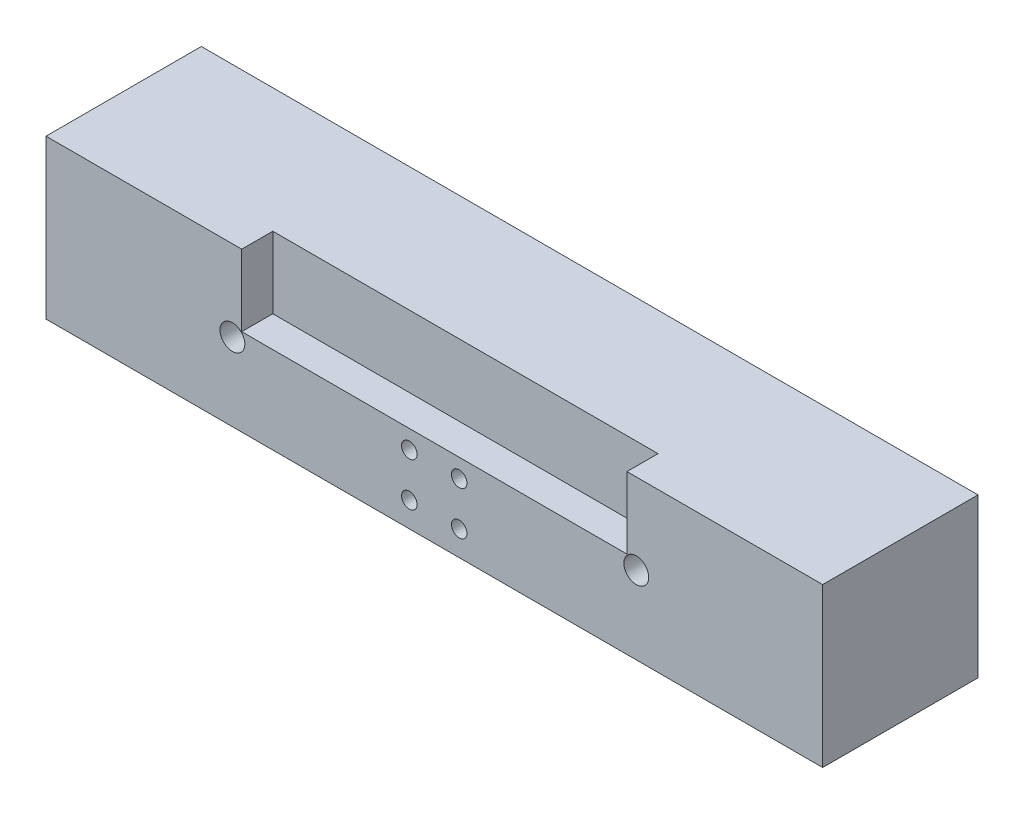
ISO-10303-21;
HEADER;
FILE_DESCRIPTION(('STEP AP214'),'2;1');
FILE_NAME('part.step','',(''),(''),'','','');
FILE_SCHEMA(('AUTOMOTIVE_DESIGN { 1 0 10303 214 1 1 1 1 }'));
ENDSEC;
DATA;
#1=APPLICATION_CONTEXT('core data for automotive mechanical design processes');
#2=APPLICATION_PROTOCOL_DEFINITION('international standard','automotive_design',2000,#1);
#3=PRODUCT_CONTEXT('',#1,'mechanical');
#4=PRODUCT('Part','Part','',(#3));
#5=PRODUCT_RELATED_PRODUCT_CATEGORY('part','',(#4));
#6=PRODUCT_DEFINITION_FORMATION('','',#4);
#7=PRODUCT_DEFINITION_CONTEXT('part definition',#1,'design');
#8=PRODUCT_DEFINITION('design','',#6,#7);
#9=PRODUCT_DEFINITION_SHAPE('','',#8);
#10=(LENGTH_UNIT() NAMED_UNIT(*) SI_UNIT(.MILLI.,.METRE.));
#11=(NAMED_UNIT(*) PLANE_ANGLE_UNIT() SI_UNIT($,.RADIAN.));
#12=(NAMED_UNIT(*) SI_UNIT($,.STERADIAN.) SOLID_ANGLE_UNIT());
#13=UNCERTAINTY_MEASURE_WITH_UNIT(LENGTH_MEASURE(1.E-05),#10,'distance_accuracy_value','');
#14=(GEOMETRIC_REPRESENTATION_CONTEXT(3) GLOBAL_UNCERTAINTY_ASSIGNED_CONTEXT((#13)) GLOBAL_UNIT_ASSIGNED_CONTEXT((#10,
#11,#12)) REPRESENTATION_CONTEXT('',''));
#15=CARTESIAN_POINT('',(0.,0.,0.));
#16=DIRECTION('',(0.,0.,1.));
#17=DIRECTION('',(1.,0.,0.));
#18=AXIS2_PLACEMENT_3D('',#15,#16,#17);
#19=CARTESIAN_POINT('',(-125.,51.,-25.));
#20=DIRECTION('',(1.,0.,0.));
#21=DIRECTION('',(0.,0.,-1.));
#22=AXIS2_PLACEMENT_3D('',#19,#20,#21);
#23=PLANE('',#22);
#24=DIRECTION('',(0.,0.,1.));
#25=VECTOR('',#24,1.);
#26=CARTESIAN_POINT('',(-125.,0.,-25.));
#27=LINE('',#26,#25);
#28=CARTESIAN_POINT('',(-125.,0.,-25.));
#29=VERTEX_POINT('',#28);
#30=CARTESIAN_POINT('',(-125.,0.,25.));
#31=VERTEX_POINT('',#30);
#32=EDGE_CURVE('E153',#29,#31,#27,.T.);
#33=ORIENTED_EDGE('',*,*,#32,.T.);
#34=DIRECTION('',(0.,-1.,0.));
#35=VECTOR('',#34,1.);
#36=CARTESIAN_POINT('',(-125.,51.,25.));
#37=LINE('',#36,#35);
#38=CARTESIAN_POINT('',(-125.,51.,25.));
#39=VERTEX_POINT('',#38);
#40=EDGE_CURVE('E11',#39,#31,#37,.T.);
#41=ORIENTED_EDGE('',*,*,#40,.F.);
#42=DIRECTION('',(0.,0.,1.));
#43=VECTOR('',#42,1.);
#44=CARTESIAN_POINT('',(-125.,51.,-25.));
#45=LINE('',#44,#43);
#46=CARTESIAN_POINT('',(-125.,51.,-25.));
#47=VERTEX_POINT('',#46);
#48=EDGE_CURVE('E162',#47,#39,#45,.T.);
#49=ORIENTED_EDGE('',*,*,#48,.F.);
#50=DIRECTION('',(0.,-1.,0.));
#51=VECTOR('',#50,1.);
#52=CARTESIAN_POINT('',(-125.,51.,-25.));
#53=LINE('',#52,#51);
#54=EDGE_CURVE('E169',#47,#29,#53,.T.);
#55=ORIENTED_EDGE('',*,*,#54,.T.);
#56=EDGE_LOOP('',(#33,#41,#49,#55));
#57=FACE_BOUND('',#56,.T.);
#58=ADVANCED_FACE('F17',(#57),#23,.F.);
#59=CARTESIAN_POINT('',(125.,51.,25.));
#60=DIRECTION('',(0.,0.,-1.));
#61=DIRECTION('',(-1.,0.,0.));
#62=AXIS2_PLACEMENT_3D('',#59,#60,#61);
#63=PLANE('',#62);
#64=CARTESIAN_POINT('',(-8.05025253169503,8.,25.));
#65=DIRECTION('',(0.,0.,1.));
#66=DIRECTION('',(1.,0.,0.));
#67=AXIS2_PLACEMENT_3D('',#64,#65,#66);
#68=CIRCLE('',#67,2.5);
#69=CARTESIAN_POINT('',(-5.55025253169503,8.,25.));
#70=VERTEX_POINT('',#69);
#71=EDGE_CURVE('E121',#70,#70,#68,.T.);
#72=ORIENTED_EDGE('',*,*,#71,.F.);
#73=EDGE_LOOP('',(#72));
#74=FACE_BOUND('',#73,.T.);
#75=CARTESIAN_POINT('',(-8.05025253169503,22.,25.));
#76=DIRECTION('',(0.,0.,1.));
#77=DIRECTION('',(1.,0.,0.));
#78=AXIS2_PLACEMENT_3D('',#75,#76,#77);
#79=CIRCLE('',#78,2.5);
#80=CARTESIAN_POINT('',(-5.55025253169503,22.,25.));
#81=VERTEX_POINT('',#80);
#82=EDGE_CURVE('E136',#81,#81,#79,.T.);
#83=ORIENTED_EDGE('',*,*,#82,.F.);
#84=EDGE_LOOP('',(#83));
#85=FACE_BOUND('',#84,.T.);
#86=CARTESIAN_POINT('',(8.,22.,25.));
#87=DIRECTION('',(0.,0.,1.));
#88=DIRECTION('',(1.,0.,0.));
#89=AXIS2_PLACEMENT_3D('',#86,#87,#88);
#90=CIRCLE('',#89,2.5);
#91=CARTESIAN_POINT('',(10.5,22.,25.));
#92=VERTEX_POINT('',#91);
#93=EDGE_CURVE('E130',#92,#92,#90,.T.);
#94=ORIENTED_EDGE('',*,*,#93,.F.);
#95=EDGE_LOOP('',(#94));
#96=FACE_BOUND('',#95,.T.);
#97=CARTESIAN_POINT('',(8.,8.,25.));
#98=DIRECTION('',(0.,0.,1.));
#99=DIRECTION('',(1.,0.,0.));
#100=AXIS2_PLACEMENT_3D('',#97,#98,#99);
#101=CIRCLE('',#100,2.5);
#102=CARTESIAN_POINT('',(10.5,8.,25.));
#103=VERTEX_POINT('',#102);
#104=EDGE_CURVE('E129',#103,#103,#101,.T.);
#105=ORIENTED_EDGE('',*,*,#104,.F.);
#106=EDGE_LOOP('',(#105));
#107=FACE_BOUND('',#106,.T.);
#108=CARTESIAN_POINT('',(-65.,25.,25.));
#109=DIRECTION('',(0.,0.,1.));
#110=DIRECTION('',(1.,0.,0.));
#111=AXIS2_PLACEMENT_3D('',#108,#109,#110);
#112=CIRCLE('',#111,4.);
#113=CARTESIAN_POINT('',(-61.,25.,25.));
#114=VERTEX_POINT('',#113);
#115=EDGE_CURVE('E154',#114,#114,#112,.T.);
#116=ORIENTED_EDGE('',*,*,#115,.F.);
#117=EDGE_LOOP('',(#116));
#118=FACE_BOUND('',#117,.T.);
#119=CARTESIAN_POINT('',(65.,25.,25.));
#120=DIRECTION('',(0.,0.,1.));
#121=DIRECTION('',(1.,0.,0.));
#122=AXIS2_PLACEMENT_3D('',#119,#120,#121);
#123=CIRCLE('',#122,4.);
#124=CARTESIAN_POINT('',(69.,25.,25.));
#125=VERTEX_POINT('',#124);
#126=EDGE_CURVE('E147',#125,#125,#123,.T.);
#127=ORIENTED_EDGE('',*,*,#126,.F.);
#128=EDGE_LOOP('',(#127));
#129=FACE_BOUND('',#128,.T.);
#130=DIRECTION('',(1.,0.,0.));
#131=VECTOR('',#130,1.);
#132=CARTESIAN_POINT('',(-62.,28.,25.));
#133=LINE('',#132,#131);
#134=CARTESIAN_POINT('',(-62.,28.,25.));
#135=VERTEX_POINT('',#134);
#136=CARTESIAN_POINT('',(62.,28.,25.));
#137=VERTEX_POINT('',#136);
#138=EDGE_CURVE('E112',#135,#137,#133,.T.);
#139=ORIENTED_EDGE('',*,*,#138,.F.);
#140=DIRECTION('',(0.,-1.,0.));
#141=VECTOR('',#140,1.);
#142=CARTESIAN_POINT('',(-62.,51.,25.));
#143=LINE('',#142,#141);
#144=CARTESIAN_POINT('',(-62.,51.,25.));
#145=VERTEX_POINT('',#144);
#146=EDGE_CURVE('E97',#145,#135,#143,.T.);
#147=ORIENTED_EDGE('',*,*,#146,.F.);
#148=DIRECTION('',(1.,0.,0.));
#149=VECTOR('',#148,1.);
#150=CARTESIAN_POINT('',(125.,51.,25.));
#151=LINE('',#150,#149);
#152=EDGE_CURVE('E68',#39,#145,#151,.T.);
#153=ORIENTED_EDGE('',*,*,#152,.F.);
#154=ORIENTED_EDGE('',*,*,#40,.T.);
#155=DIRECTION('',(1.,0.,0.));
#156=VECTOR('',#155,1.);
#157=CARTESIAN_POINT('',(125.,0.,25.));
#158=LINE('',#157,#156);
#159=CARTESIAN_POINT('',(125.,0.,25.));
#160=VERTEX_POINT('',#159);
#161=EDGE_CURVE('E172',#31,#160,#158,.T.);
#162=ORIENTED_EDGE('',*,*,#161,.T.);
#163=DIRECTION('',(0.,-1.,0.));
#164=VECTOR('',#163,1.);
#165=CARTESIAN_POINT('',(125.,51.,25.));
#166=LINE('',#165,#164);
#167=CARTESIAN_POINT('',(125.,51.,25.));
#168=VERTEX_POINT('',#167);
#169=EDGE_CURVE('E24',#168,#160,#166,.T.);
#170=ORIENTED_EDGE('',*,*,#169,.F.);
#171=CARTESIAN_POINT('',(62.,51.,25.));
#172=VERTEX_POINT('',#171);
#173=EDGE_CURVE('E164',#172,#168,#151,.T.);
#174=ORIENTED_EDGE('',*,*,#173,.F.);
#175=DIRECTION('',(0.,1.,0.));
#176=VECTOR('',#175,1.);
#177=CARTESIAN_POINT('',(62.,51.,25.));
#178=LINE('',#177,#176);
#179=EDGE_CURVE('E110',#137,#172,#178,.T.);
#180=ORIENTED_EDGE('',*,*,#179,.F.);
#181=EDGE_LOOP('',(#139,#147,#153,#154,#162,#170,#174,#180));
#182=FACE_BOUND('',#181,.T.);
#183=ADVANCED_FACE('F205',(#74,#85,#96,#107,#118,#129,#182),#63,.F.);
#184=CARTESIAN_POINT('',(125.,51.,-25.));
#185=DIRECTION('',(-1.,0.,0.));
#186=DIRECTION('',(0.,0.,1.));
#187=AXIS2_PLACEMENT_3D('',#184,#185,#186);
#188=PLANE('',#187);
#189=DIRECTION('',(0.,0.,-1.));
#190=VECTOR('',#189,1.);
#191=CARTESIAN_POINT('',(125.,0.,-25.));
#192=LINE('',#191,#190);
#193=CARTESIAN_POINT('',(125.,0.,-25.));
#194=VERTEX_POINT('',#193);
#195=EDGE_CURVE('E174',#160,#194,#192,.T.);
#196=ORIENTED_EDGE('',*,*,#195,.T.);
#197=DIRECTION('',(0.,-1.,0.));
#198=VECTOR('',#197,1.);
#199=CARTESIAN_POINT('',(125.,51.,-25.));
#200=LINE('',#199,#198);
#201=CARTESIAN_POINT('',(125.,51.,-25.));
#202=VERTEX_POINT('',#201);
#203=EDGE_CURVE('E178',#202,#194,#200,.T.);
#204=ORIENTED_EDGE('',*,*,#203,.F.);
#205=DIRECTION('',(0.,0.,-1.));
#206=VECTOR('',#205,1.);
#207=CARTESIAN_POINT('',(125.,51.,-25.));
#208=LINE('',#207,#206);
#209=EDGE_CURVE('E166',#168,#202,#208,.T.);
#210=ORIENTED_EDGE('',*,*,#209,.F.);
#211=ORIENTED_EDGE('',*,*,#169,.T.);
#212=EDGE_LOOP('',(#196,#204,#210,#211));
#213=FACE_BOUND('',#212,.T.);
#214=ADVANCED_FACE('F184',(#213),#188,.F.);
#215=CARTESIAN_POINT('',(125.,51.,-25.));
#216=DIRECTION('',(0.,0.,1.));
#217=DIRECTION('',(1.,0.,0.));
#218=AXIS2_PLACEMENT_3D('',#215,#216,#217);
#219=PLANE('',#218);
#220=CARTESIAN_POINT('',(-65.,25.,-25.));
#221=DIRECTION('',(0.,0.,1.));
#222=DIRECTION('',(1.,0.,0.));
#223=AXIS2_PLACEMENT_3D('',#220,#221,#222);
#224=CIRCLE('',#223,4.);
#225=CARTESIAN_POINT('',(-61.,25.,-25.));
#226=VERTEX_POINT('',#225);
#227=EDGE_CURVE('E150',#226,#226,#224,.T.);
#228=ORIENTED_EDGE('',*,*,#227,.T.);
#229=EDGE_LOOP('',(#228));
#230=FACE_BOUND('',#229,.T.);
#231=CARTESIAN_POINT('',(65.,25.,-25.));
#232=DIRECTION('',(0.,0.,1.));
#233=DIRECTION('',(1.,0.,0.));
#234=AXIS2_PLACEMENT_3D('',#231,#232,#233);
#235=CIRCLE('',#234,4.);
#236=CARTESIAN_POINT('',(69.,25.,-25.));
#237=VERTEX_POINT('',#236);
#238=EDGE_CURVE('E157',#237,#237,#235,.T.);
#239=ORIENTED_EDGE('',*,*,#238,.T.);
#240=EDGE_LOOP('',(#239));
#241=FACE_BOUND('',#240,.T.);
#242=DIRECTION('',(-1.,0.,0.));
#243=VECTOR('',#242,1.);
#244=CARTESIAN_POINT('',(125.,0.,-25.));
#245=LINE('',#244,#243);
#246=EDGE_CURVE('E61',#194,#29,#245,.T.);
#247=ORIENTED_EDGE('',*,*,#246,.T.);
#248=ORIENTED_EDGE('',*,*,#54,.F.);
#249=DIRECTION('',(-1.,0.,0.));
#250=VECTOR('',#249,1.);
#251=CARTESIAN_POINT('',(125.,51.,-25.));
#252=LINE('',#251,#250);
#253=EDGE_CURVE('E40',#202,#47,#252,.T.);
#254=ORIENTED_EDGE('',*,*,#253,.F.);
#255=ORIENTED_EDGE('',*,*,#203,.T.);
#256=EDGE_LOOP('',(#247,#248,#254,#255));
#257=FACE_BOUND('',#256,.T.);
#258=ADVANCED_FACE('F193',(#230,#241,#257),#219,.F.);
#259=CARTESIAN_POINT('',(0.,51.,0.));
#260=DIRECTION('',(0.,-1.,0.));
#261=DIRECTION('',(0.,0.,-1.));
#262=AXIS2_PLACEMENT_3D('',#259,#260,#261);
#263=PLANE('',#262);
#264=ORIENTED_EDGE('',*,*,#152,.T.);
#265=DIRECTION('',(0.,0.,1.));
#266=VECTOR('',#265,1.);
#267=CARTESIAN_POINT('',(-62.,51.,15.));
#268=LINE('',#267,#266);
#269=CARTESIAN_POINT('',(-62.,51.,15.));
#270=VERTEX_POINT('',#269);
#271=EDGE_CURVE('E119',#270,#145,#268,.T.);
#272=ORIENTED_EDGE('',*,*,#271,.F.);
#273=DIRECTION('',(-1.,0.,0.));
#274=VECTOR('',#273,1.);
#275=CARTESIAN_POINT('',(-62.,51.,15.));
#276=LINE('',#275,#274);
#277=CARTESIAN_POINT('',(62.,51.,15.));
#278=VERTEX_POINT('',#277);
#279=EDGE_CURVE('E102',#278,#270,#276,.T.);
#280=ORIENTED_EDGE('',*,*,#279,.F.);
#281=DIRECTION('',(0.,0.,1.));
#282=VECTOR('',#281,1.);
#283=CARTESIAN_POINT('',(62.,51.,15.));
#284=LINE('',#283,#282);
#285=EDGE_CURVE('E122',#278,#172,#284,.T.);
#286=ORIENTED_EDGE('',*,*,#285,.T.);
#287=ORIENTED_EDGE('',*,*,#173,.T.);
#288=ORIENTED_EDGE('',*,*,#209,.T.);
#289=ORIENTED_EDGE('',*,*,#253,.T.);
#290=ORIENTED_EDGE('',*,*,#48,.T.);
#291=EDGE_LOOP('',(#264,#272,#280,#286,#287,#288,#289,#290));
#292=FACE_BOUND('',#291,.T.);
#293=ADVANCED_FACE('F195',(#292),#263,.F.);
#294=CARTESIAN_POINT('',(0.,0.,0.));
#295=DIRECTION('',(0.,-1.,0.));
#296=DIRECTION('',(0.,0.,-1.));
#297=AXIS2_PLACEMENT_3D('',#294,#295,#296);
#298=PLANE('',#297);
#299=ORIENTED_EDGE('',*,*,#32,.F.);
#300=ORIENTED_EDGE('',*,*,#246,.F.);
#301=ORIENTED_EDGE('',*,*,#195,.F.);
#302=ORIENTED_EDGE('',*,*,#161,.F.);
#303=EDGE_LOOP('',(#299,#300,#301,#302));
#304=FACE_BOUND('',#303,.T.);
#305=ADVANCED_FACE('F189',(#304),#298,.T.);
#306=CARTESIAN_POINT('',(65.,25.,-25.));
#307=DIRECTION('',(0.,0.,1.));
#308=DIRECTION('',(1.,0.,0.));
#309=AXIS2_PLACEMENT_3D('',#306,#307,#308);
#310=CYLINDRICAL_SURFACE('',#309,4.);
#311=ORIENTED_EDGE('',*,*,#238,.F.);
#312=EDGE_LOOP('',(#311));
#313=FACE_BOUND('',#312,.T.);
#314=ORIENTED_EDGE('',*,*,#126,.T.);
#315=EDGE_LOOP('',(#314));
#316=FACE_BOUND('',#315,.T.);
#317=ADVANCED_FACE('F278',(#313,#316),#310,.F.);
#318=CARTESIAN_POINT('',(-65.,25.,-25.));
#319=DIRECTION('',(0.,0.,1.));
#320=DIRECTION('',(1.,0.,0.));
#321=AXIS2_PLACEMENT_3D('',#318,#319,#320);
#322=CYLINDRICAL_SURFACE('',#321,4.);
#323=ORIENTED_EDGE('',*,*,#227,.F.);
#324=EDGE_LOOP('',(#323));
#325=FACE_BOUND('',#324,.T.);
#326=ORIENTED_EDGE('',*,*,#115,.T.);
#327=EDGE_LOOP('',(#326));
#328=FACE_BOUND('',#327,.T.);
#329=ADVANCED_FACE('F274',(#325,#328),#322,.F.);
#330=CARTESIAN_POINT('',(8.,8.,15.));
#331=DIRECTION('',(0.,0.,1.));
#332=DIRECTION('',(1.,0.,0.));
#333=AXIS2_PLACEMENT_3D('',#330,#331,#332);
#334=CYLINDRICAL_SURFACE('',#333,2.5);
#335=CARTESIAN_POINT('',(8.,8.,15.));
#336=DIRECTION('',(0.,0.,1.));
#337=DIRECTION('',(1.,0.,0.));
#338=AXIS2_PLACEMENT_3D('',#335,#336,#337);
#339=CIRCLE('',#338,2.5);
#340=CARTESIAN_POINT('',(10.5,8.,15.));
#341=VERTEX_POINT('',#340);
#342=EDGE_CURVE('E144',#341,#341,#339,.T.);
#343=ORIENTED_EDGE('',*,*,#342,.F.);
#344=EDGE_LOOP('',(#343));
#345=FACE_BOUND('',#344,.T.);
#346=ORIENTED_EDGE('',*,*,#104,.T.);
#347=EDGE_LOOP('',(#346));
#348=FACE_BOUND('',#347,.T.);
#349=ADVANCED_FACE('F270',(#345,#348),#334,.F.);
#350=CARTESIAN_POINT('',(8.,8.,15.));
#351=DIRECTION('',(0.,0.,1.));
#352=DIRECTION('',(1.,0.,0.));
#353=AXIS2_PLACEMENT_3D('',#350,#351,#352);
#354=PLANE('',#353);
#355=ORIENTED_EDGE('',*,*,#342,.T.);
#356=EDGE_LOOP('',(#355));
#357=FACE_BOUND('',#356,.T.);
#358=ADVANCED_FACE('F252',(#357),#354,.T.);
#359=CARTESIAN_POINT('',(8.,22.,15.));
#360=DIRECTION('',(0.,0.,1.));
#361=DIRECTION('',(1.,0.,0.));
#362=AXIS2_PLACEMENT_3D('',#359,#360,#361);
#363=CYLINDRICAL_SURFACE('',#362,2.5);
#364=CARTESIAN_POINT('',(8.,22.,15.));
#365=DIRECTION('',(0.,0.,1.));
#366=DIRECTION('',(1.,0.,0.));
#367=AXIS2_PLACEMENT_3D('',#364,#365,#366);
#368=CIRCLE('',#367,2.5);
#369=CARTESIAN_POINT('',(10.5,22.,15.));
#370=VERTEX_POINT('',#369);
#371=EDGE_CURVE('E126',#370,#370,#368,.T.);
#372=ORIENTED_EDGE('',*,*,#371,.F.);
#373=EDGE_LOOP('',(#372));
#374=FACE_BOUND('',#373,.T.);
#375=ORIENTED_EDGE('',*,*,#93,.T.);
#376=EDGE_LOOP('',(#375));
#377=FACE_BOUND('',#376,.T.);
#378=ADVANCED_FACE('F248',(#374,#377),#363,.F.);
#379=CARTESIAN_POINT('',(8.,22.,15.));
#380=DIRECTION('',(0.,0.,1.));
#381=DIRECTION('',(1.,0.,0.));
#382=AXIS2_PLACEMENT_3D('',#379,#380,#381);
#383=PLANE('',#382);
#384=ORIENTED_EDGE('',*,*,#371,.T.);
#385=EDGE_LOOP('',(#384));
#386=FACE_BOUND('',#385,.T.);
#387=ADVANCED_FACE('F244',(#386),#383,.T.);
#388=CARTESIAN_POINT('',(-8.05025253169503,22.,15.));
#389=DIRECTION('',(0.,0.,1.));
#390=DIRECTION('',(1.,0.,0.));
#391=AXIS2_PLACEMENT_3D('',#388,#389,#390);
#392=CYLINDRICAL_SURFACE('',#391,2.5);
#393=CARTESIAN_POINT('',(-8.05025253169503,22.,15.));
#394=DIRECTION('',(0.,0.,1.));
#395=DIRECTION('',(1.,0.,0.));
#396=AXIS2_PLACEMENT_3D('',#393,#394,#395);
#397=CIRCLE('',#396,2.5);
#398=CARTESIAN_POINT('',(-5.55025253169503,22.,15.));
#399=VERTEX_POINT('',#398);
#400=EDGE_CURVE('E133',#399,#399,#397,.T.);
#401=ORIENTED_EDGE('',*,*,#400,.F.);
#402=EDGE_LOOP('',(#401));
#403=FACE_BOUND('',#402,.T.);
#404=ORIENTED_EDGE('',*,*,#82,.T.);
#405=EDGE_LOOP('',(#404));
#406=FACE_BOUND('',#405,.T.);
#407=ADVANCED_FACE('F247',(#403,#406),#392,.F.);
#408=CARTESIAN_POINT('',(-8.05025253169503,22.,15.));
#409=DIRECTION('',(0.,0.,1.));
#410=DIRECTION('',(1.,0.,0.));
#411=AXIS2_PLACEMENT_3D('',#408,#409,#410);
#412=PLANE('',#411);
#413=ORIENTED_EDGE('',*,*,#400,.T.);
#414=EDGE_LOOP('',(#413));
#415=FACE_BOUND('',#414,.T.);
#416=ADVANCED_FACE('F254',(#415),#412,.T.);
#417=CARTESIAN_POINT('',(-8.05025253169503,8.,15.));
#418=DIRECTION('',(0.,0.,1.));
#419=DIRECTION('',(1.,0.,0.));
#420=AXIS2_PLACEMENT_3D('',#417,#418,#419);
#421=CYLINDRICAL_SURFACE('',#420,2.5);
#422=CARTESIAN_POINT('',(-8.05025253169503,8.,15.));
#423=DIRECTION('',(0.,0.,1.));
#424=DIRECTION('',(1.,0.,0.));
#425=AXIS2_PLACEMENT_3D('',#422,#423,#424);
#426=CIRCLE('',#425,2.5);
#427=CARTESIAN_POINT('',(-5.55025253169503,8.,15.));
#428=VERTEX_POINT('',#427);
#429=EDGE_CURVE('E139',#428,#428,#426,.T.);
#430=ORIENTED_EDGE('',*,*,#429,.F.);
#431=EDGE_LOOP('',(#430));
#432=FACE_BOUND('',#431,.T.);
#433=ORIENTED_EDGE('',*,*,#71,.T.);
#434=EDGE_LOOP('',(#433));
#435=FACE_BOUND('',#434,.T.);
#436=ADVANCED_FACE('F257',(#432,#435),#421,.F.);
#437=CARTESIAN_POINT('',(-8.05025253169503,8.,15.));
#438=DIRECTION('',(0.,0.,1.));
#439=DIRECTION('',(1.,0.,0.));
#440=AXIS2_PLACEMENT_3D('',#437,#438,#439);
#441=PLANE('',#440);
#442=ORIENTED_EDGE('',*,*,#429,.T.);
#443=EDGE_LOOP('',(#442));
#444=FACE_BOUND('',#443,.T.);
#445=ADVANCED_FACE('F240',(#444),#441,.T.);
#446=CARTESIAN_POINT('',(-62.,51.,15.));
#447=DIRECTION('',(-1.,0.,0.));
#448=DIRECTION('',(0.,0.,1.));
#449=AXIS2_PLACEMENT_3D('',#446,#447,#448);
#450=PLANE('',#449);
#451=ORIENTED_EDGE('',*,*,#146,.T.);
#452=DIRECTION('',(0.,0.,1.));
#453=VECTOR('',#452,1.);
#454=CARTESIAN_POINT('',(-62.,28.,15.));
#455=LINE('',#454,#453);
#456=CARTESIAN_POINT('',(-62.,28.,15.));
#457=VERTEX_POINT('',#456);
#458=EDGE_CURVE('E92',#457,#135,#455,.T.);
#459=ORIENTED_EDGE('',*,*,#458,.F.);
#460=DIRECTION('',(0.,-1.,0.));
#461=VECTOR('',#460,1.);
#462=CARTESIAN_POINT('',(-62.,51.,15.));
#463=LINE('',#462,#461);
#464=EDGE_CURVE('E96',#270,#457,#463,.T.);
#465=ORIENTED_EDGE('',*,*,#464,.F.);
#466=ORIENTED_EDGE('',*,*,#271,.T.);
#467=EDGE_LOOP('',(#451,#459,#465,#466));
#468=FACE_BOUND('',#467,.T.);
#469=ADVANCED_FACE('F94',(#468),#450,.F.);
#470=CARTESIAN_POINT('',(62.,51.,15.));
#471=DIRECTION('',(1.,0.,0.));
#472=DIRECTION('',(0.,0.,-1.));
#473=AXIS2_PLACEMENT_3D('',#470,#471,#472);
#474=PLANE('',#473);
#475=ORIENTED_EDGE('',*,*,#179,.T.);
#476=ORIENTED_EDGE('',*,*,#285,.F.);
#477=DIRECTION('',(0.,1.,0.));
#478=VECTOR('',#477,1.);
#479=CARTESIAN_POINT('',(62.,51.,15.));
#480=LINE('',#479,#478);
#481=CARTESIAN_POINT('',(62.,28.,15.));
#482=VERTEX_POINT('',#481);
#483=EDGE_CURVE('E31',#482,#278,#480,.T.);
#484=ORIENTED_EDGE('',*,*,#483,.F.);
#485=DIRECTION('',(0.,0.,1.));
#486=VECTOR('',#485,1.);
#487=CARTESIAN_POINT('',(62.,28.,15.));
#488=LINE('',#487,#486);
#489=EDGE_CURVE('E101',#482,#137,#488,.T.);
#490=ORIENTED_EDGE('',*,*,#489,.T.);
#491=EDGE_LOOP('',(#475,#476,#484,#490));
#492=FACE_BOUND('',#491,.T.);
#493=ADVANCED_FACE('F231',(#492),#474,.F.);
#494=CARTESIAN_POINT('',(-62.,28.,15.));
#495=DIRECTION('',(0.,-1.,0.));
#496=DIRECTION('',(0.,0.,-1.));
#497=AXIS2_PLACEMENT_3D('',#494,#495,#496);
#498=PLANE('',#497);
#499=ORIENTED_EDGE('',*,*,#138,.T.);
#500=ORIENTED_EDGE('',*,*,#489,.F.);
#501=DIRECTION('',(1.,0.,0.));
#502=VECTOR('',#501,1.);
#503=CARTESIAN_POINT('',(-62.,28.,15.));
#504=LINE('',#503,#502);
#505=EDGE_CURVE('E104',#457,#482,#504,.T.);
#506=ORIENTED_EDGE('',*,*,#505,.F.);
#507=ORIENTED_EDGE('',*,*,#458,.T.);
#508=EDGE_LOOP('',(#499,#500,#506,#507));
#509=FACE_BOUND('',#508,.T.);
#510=ADVANCED_FACE('F105',(#509),#498,.F.);
#511=CARTESIAN_POINT('',(0.,0.,15.));
#512=DIRECTION('',(0.,0.,1.));
#513=DIRECTION('',(1.,0.,0.));
#514=AXIS2_PLACEMENT_3D('',#511,#512,#513);
#515=PLANE('',#514);
#516=ORIENTED_EDGE('',*,*,#464,.T.);
#517=ORIENTED_EDGE('',*,*,#505,.T.);
#518=ORIENTED_EDGE('',*,*,#483,.T.);
#519=ORIENTED_EDGE('',*,*,#279,.T.);
#520=EDGE_LOOP('',(#516,#517,#518,#519));
#521=FACE_BOUND('',#520,.T.);
#522=ADVANCED_FACE('F107',(#521),#515,.T.);
#523=CLOSED_SHELL('',(#58,#183,#214,#258,#293,#305,#317,#329,#349,#358,#378,#387,#407,#416,#436,
#445,#469,#493,#510,#522));
#524=MANIFOLD_SOLID_BREP('B1',#523);
#525=ADVANCED_BREP_SHAPE_REPRESENTATION('',(#18,#524),#14);
#526=SHAPE_DEFINITION_REPRESENTATION(#9,#525);
ENDSEC;
END-ISO-10303-21;
